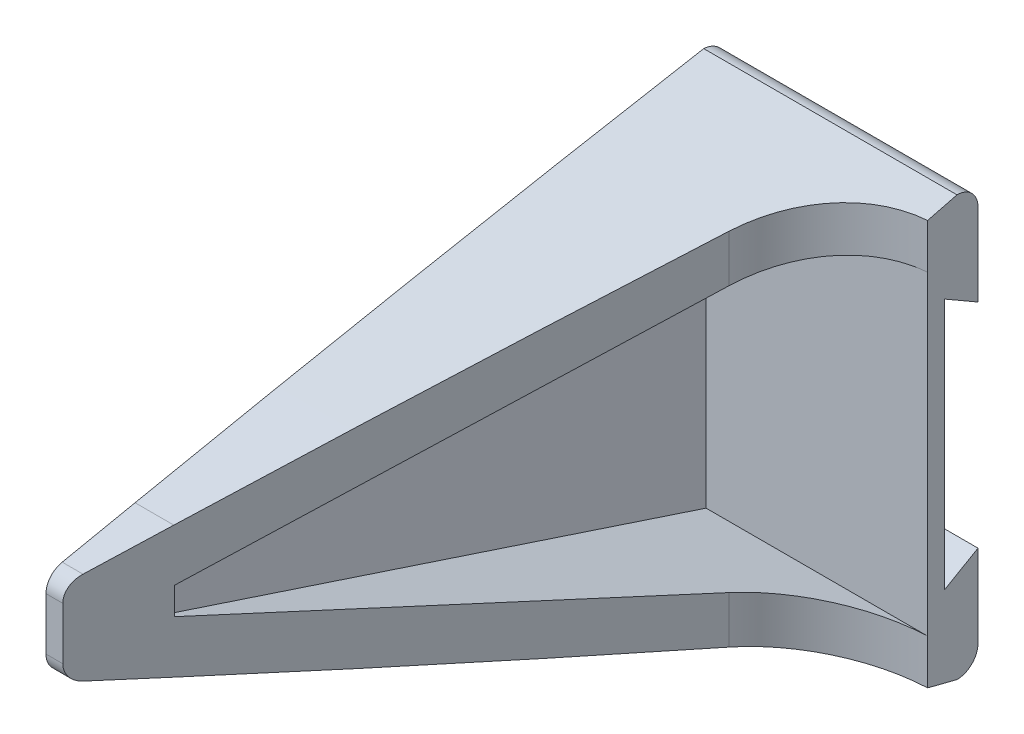
ISO-10303-21;
HEADER;
FILE_DESCRIPTION(('STEP AP214'),'2;1');
FILE_NAME('part.step','',(''),(''),'','','');
FILE_SCHEMA(('AUTOMOTIVE_DESIGN { 1 0 10303 214 1 1 1 1 }'));
ENDSEC;
DATA;
#1=APPLICATION_CONTEXT('core data for automotive mechanical design processes');
#2=APPLICATION_PROTOCOL_DEFINITION('international standard','automotive_design',2000,#1);
#3=PRODUCT_CONTEXT('',#1,'mechanical');
#4=PRODUCT('Part','Part','',(#3));
#5=PRODUCT_RELATED_PRODUCT_CATEGORY('part','',(#4));
#6=PRODUCT_DEFINITION_FORMATION('','',#4);
#7=PRODUCT_DEFINITION_CONTEXT('part definition',#1,'design');
#8=PRODUCT_DEFINITION('design','',#6,#7);
#9=PRODUCT_DEFINITION_SHAPE('','',#8);
#10=(LENGTH_UNIT() NAMED_UNIT(*) SI_UNIT(.MILLI.,.METRE.));
#11=(NAMED_UNIT(*) PLANE_ANGLE_UNIT() SI_UNIT($,.RADIAN.));
#12=(NAMED_UNIT(*) SI_UNIT($,.STERADIAN.) SOLID_ANGLE_UNIT());
#13=UNCERTAINTY_MEASURE_WITH_UNIT(LENGTH_MEASURE(1.E-05),#10,'distance_accuracy_value','');
#14=(GEOMETRIC_REPRESENTATION_CONTEXT(3) GLOBAL_UNCERTAINTY_ASSIGNED_CONTEXT((#13)) GLOBAL_UNIT_ASSIGNED_CONTEXT((#10,
#11,#12)) REPRESENTATION_CONTEXT('',''));
#15=CARTESIAN_POINT('',(0.,0.,0.));
#16=DIRECTION('',(0.,0.,1.));
#17=DIRECTION('',(1.,0.,0.));
#18=AXIS2_PLACEMENT_3D('',#15,#16,#17);
#19=CARTESIAN_POINT('',(-5.,0.,0.));
#20=DIRECTION('',(0.,0.961523946559478,-0.274721131682086));
#21=DIRECTION('',(-1.,0.,0.));
#22=AXIS2_PLACEMENT_3D('',#19,#20,#21);
#23=PLANE('',#22);
#24=DIRECTION('',(-1.,0.,0.));
#25=VECTOR('',#24,1.);
#26=CARTESIAN_POINT('',(11.2500160171539,17.1564270768965,60.0474938743614));
#27=LINE('',#26,#25);
#28=CARTESIAN_POINT('',(0.27010915556701,17.1564270768968,60.0474938743613));
#29=VERTEX_POINT('',#28);
#30=CARTESIAN_POINT('',(-4.34517418158299,17.1564270768968,60.0474938743613));
#31=VERTEX_POINT('',#30);
#32=EDGE_CURVE('E214',#29,#31,#27,.T.);
#33=ORIENTED_EDGE('',*,*,#32,.F.);
#34=DIRECTION('',(0.301252602829649,-0.26195878897275,-0.916855747742409));
#35=VECTOR('',#34,1.);
#36=CARTESIAN_POINT('',(8.15477337959658,10.3001972147053,36.0506897142713));
#37=LINE('',#36,#35);
#38=CARTESIAN_POINT('',(-2.40415206960112,19.481871655173,68.1865497770469));
#39=VERTEX_POINT('',#38);
#40=EDGE_CURVE('E255',#39,#29,#37,.T.);
#41=ORIENTED_EDGE('',*,*,#40,.F.);
#42=DIRECTION('',(0.999999994860841,-2.78517886830836E-05,-9.74812589382085E-05));
#43=VECTOR('',#42,1.);
#44=CARTESIAN_POINT('',(-4.9961902674064,19.4819438480736,68.1868024521949));
#45=LINE('',#44,#43);
#46=CARTESIAN_POINT('',(-4.8806474065743,19.4819406299982,68.1867911889313));
#47=VERTEX_POINT('',#46);
#48=EDGE_CURVE('E228',#47,#39,#45,.T.);
#49=ORIENTED_EDGE('',*,*,#48,.F.);
#50=DIRECTION('',(-0.0631311605082481,0.274173128614111,0.959605935850145));
#51=VECTOR('',#50,1.);
#52=CARTESIAN_POINT('',(-0.221379312874563,-0.752854675794736,-2.63499132601715));
#53=LINE('',#52,#51);
#54=EDGE_CURVE('E201',#31,#47,#53,.T.);
#55=ORIENTED_EDGE('',*,*,#54,.F.);
#56=EDGE_LOOP('',(#33,#41,#49,#55));
#57=FACE_BOUND('',#56,.T.);
#58=ADVANCED_FACE('F17',(#57),#23,.F.);
#59=CARTESIAN_POINT('',(30.8686455946263,50.,14.9748273723251));
#60=DIRECTION('',(0.,1.,0.));
#61=DIRECTION('',(-0.0579097063084208,0.,-0.998321824821672));
#62=AXIS2_PLACEMENT_3D('',#59,#60,#61);
#63=CYLINDRICAL_SURFACE('',#62,15.);
#64=CARTESIAN_POINT('',(16.6181693590193,46.4452021108592,10.2925280377675));
#65=CARTESIAN_POINT('',(16.7504928744578,46.55038999976,9.88967875900254));
#66=CARTESIAN_POINT('',(16.9000915577674,46.6540806618818,9.49209916432343));
#67=CARTESIAN_POINT('',(17.2328506889254,46.8577784280894,8.71021888646992));
#68=CARTESIAN_POINT('',(17.4160143939234,46.9577851735558,8.32591949631197));
#69=CARTESIAN_POINT('',(17.8150095436833,47.1534644660084,7.57319089787189));
#70=CARTESIAN_POINT('',(18.0308606807906,47.2491343548304,7.20477142939984));
#71=CARTESIAN_POINT('',(18.4938397219211,47.4353899824434,6.48680022303801));
#72=CARTESIAN_POINT('',(18.7409660845619,47.5259759714741,6.13724755651849));
#73=CARTESIAN_POINT('',(19.265279990854,47.7015080449932,5.45927399383423));
#74=CARTESIAN_POINT('',(19.5425015231269,47.7864475743285,5.13087767193375));
#75=CARTESIAN_POINT('',(20.124990929936,47.9499358524807,4.49824598358979));
#76=CARTESIAN_POINT('',(20.4302587340361,48.0284846173466,4.1940105564715));
#77=CARTESIAN_POINT('',(21.0666734538464,48.1785553382833,3.61229603263777));
#78=CARTESIAN_POINT('',(21.397809752011,48.2500801503622,3.33480606181463));
#79=CARTESIAN_POINT('',(22.0837662302931,48.3855703691712,2.80878092093615));
#80=CARTESIAN_POINT('',(22.4385852053635,48.4495361600692,2.5602442794106));
#81=CARTESIAN_POINT('',(23.161064325519,48.5680290954461,2.09955837952303));
#82=CARTESIAN_POINT('',(23.5282492459639,48.6227377382413,1.88671042008909));
#83=CARTESIAN_POINT('',(24.2802142469391,48.7240060820292,1.4925141623235));
#84=CARTESIAN_POINT('',(24.6649934127516,48.7705662060539,1.31116422876913));
#85=CARTESIAN_POINT('',(25.4491022783811,48.8551327243682,0.981640975074085));
#86=CARTESIAN_POINT('',(25.8484216545086,48.8931450551961,0.833444629763661));
#87=CARTESIAN_POINT('',(26.6587269192887,48.960329807256,0.571430078871008));
#88=CARTESIAN_POINT('',(27.0697082864151,48.9895056046793,0.45759874343676));
#89=CARTESIAN_POINT('',(27.8981270662143,49.038655875498,0.26579257016544));
#90=CARTESIAN_POINT('',(28.3155155381839,49.0586808798518,0.187620823286847));
#91=CARTESIAN_POINT('',(28.9451917950294,49.0818532564691,0.0971513952901365));
#92=CARTESIAN_POINT('',(29.1555140760904,49.0884306833989,0.0714694263869918));
#93=CARTESIAN_POINT('',(29.5771225641624,49.0992992076499,0.0290303714213888));
#94=CARTESIAN_POINT('',(29.7884088010447,49.1035902336274,0.0122735638558454));
#95=CARTESIAN_POINT('',(30.0000000000001,49.1067332100287,0.));
#96=B_SPLINE_CURVE_WITH_KNOTS('',3,(#64,#65,#66,#67,#68,#69,#70,#71,#72,#73,#74,#75,#76,#77,#78,
#79,#80,#81,#82,#83,#84,#85,#86,#87,#88,#89,#90,#91,#92,#93,#94,#95),.UNSPECIFIED.,.F.,.F.,(4,2,
2,2,2,2,2,2,2,2,2,2,2,2,2,4),(0.,1.31027882594637,2.62068486874322,3.93188352163661,
5.24301757796929,6.55564810689964,7.8682753393404,9.18036661534949,10.4923911789509,
11.7745922198976,13.0567266753576,14.3379679047848,15.6187189885599,16.892309628219,
17.5280942569491,18.1638987232685),.UNSPECIFIED.);
#97=CARTESIAN_POINT('',(16.6181693590191,46.445202110859,10.2925280377679));
#98=VERTEX_POINT('',#97);
#99=CARTESIAN_POINT('',(30.,49.1067332100289,0.));
#100=VERTEX_POINT('',#99);
#101=EDGE_CURVE('E20',#98,#100,#96,.T.);
#102=ORIENTED_EDGE('',*,*,#101,.F.);
#103=DIRECTION('',(0.,-1.,0.));
#104=VECTOR('',#103,1.);
#105=CARTESIAN_POINT('',(16.618169359019,50.,10.2925280377684));
#106=LINE('',#105,#104);
#107=CARTESIAN_POINT('',(16.618169359019,40.8191836101221,10.2925280377684));
#108=VERTEX_POINT('',#107);
#109=EDGE_CURVE('E76',#98,#108,#106,.T.);
#110=ORIENTED_EDGE('',*,*,#109,.T.);
#111=CARTESIAN_POINT('',(30.8686455946263,39.4813838384571,14.9748273723251));
#112=DIRECTION('',(0.,-0.961523949713401,-0.274721120643354));
#113=DIRECTION('',(0.,0.274721120643354,-0.961523949713401));
#114=AXIS2_PLACEMENT_3D('',#111,#112,#113);
#115=ELLIPSE('',#114,15.6002354434032,15.);
#116=CARTESIAN_POINT('',(30.,43.7599058226387,0.));
#117=VERTEX_POINT('',#116);
#118=EDGE_CURVE('E11',#108,#117,#115,.T.);
#119=ORIENTED_EDGE('',*,*,#118,.T.);
#120=DIRECTION('',(0.,-1.,0.));
#121=VECTOR('',#120,1.);
#122=CARTESIAN_POINT('',(30.,50.,0.));
#123=LINE('',#122,#121);
#124=EDGE_CURVE('E264',#100,#117,#123,.T.);
#125=ORIENTED_EDGE('',*,*,#124,.F.);
#126=EDGE_LOOP('',(#102,#110,#119,#125));
#127=FACE_BOUND('',#126,.T.);
#128=ADVANCED_FACE('F314',(#127),#63,.F.);
#129=CARTESIAN_POINT('',(-5.,43.7599058226387,0.));
#130=DIRECTION('',(0.,0.961523949713401,0.274721120643354));
#131=DIRECTION('',(1.,0.,0.));
#132=AXIS2_PLACEMENT_3D('',#129,#130,#131);
#133=PLANE('',#132);
#134=DIRECTION('',(0.0631311607145007,0.274173117593814,-0.959605938985232));
#135=VECTOR('',#134,1.);
#136=CARTESIAN_POINT('',(2.4529121272911,38.7177710550866,17.647472190454));
#137=LINE('',#136,#135);
#138=CARTESIAN_POINT('',(-0.333402682970778,26.6170491693912,60.));
#139=VERTEX_POINT('',#138);
#140=CARTESIAN_POINT('',(3.61391515759579,43.7599058226387,0.));
#141=VERTEX_POINT('',#140);
#142=EDGE_CURVE('E157',#139,#141,#137,.T.);
#143=ORIENTED_EDGE('',*,*,#142,.T.);
#144=DIRECTION('',(1.,0.,0.));
#145=VECTOR('',#144,1.);
#146=CARTESIAN_POINT('',(-5.,43.7599058226387,0.));
#147=LINE('',#146,#145);
#148=EDGE_CURVE('E46',#141,#117,#147,.T.);
#149=ORIENTED_EDGE('',*,*,#148,.T.);
#150=ORIENTED_EDGE('',*,*,#118,.F.);
#151=DIRECTION('',(0.301252603728119,0.261958778368849,-0.916855750476884));
#152=VECTOR('',#151,1.);
#153=CARTESIAN_POINT('',(6.42810010749945,31.9582540792652,41.3057822815234));
#154=LINE('',#153,#152);
#155=CARTESIAN_POINT('',(0.285714285714288,26.6170491693912,60.));
#156=VERTEX_POINT('',#155);
#157=EDGE_CURVE('E160',#156,#108,#154,.T.);
#158=ORIENTED_EDGE('',*,*,#157,.F.);
#159=DIRECTION('',(1.,0.,0.));
#160=VECTOR('',#159,1.);
#161=CARTESIAN_POINT('',(-5.,26.6170491693912,60.));
#162=LINE('',#161,#160);
#163=EDGE_CURVE('E32',#139,#156,#162,.T.);
#164=ORIENTED_EDGE('',*,*,#163,.F.);
#165=EDGE_LOOP('',(#143,#149,#150,#158,#164));
#166=FACE_BOUND('',#165,.T.);
#167=ADVANCED_FACE('F156',(#166),#133,.F.);
#168=CARTESIAN_POINT('',(-5.,26.6170491693912,60.));
#169=DIRECTION('',(0.,0.,1.));
#170=DIRECTION('',(1.,0.,0.));
#171=AXIS2_PLACEMENT_3D('',#168,#169,#170);
#172=PLANE('',#171);
#173=DIRECTION('',(0.,1.,0.));
#174=VECTOR('',#173,1.);
#175=CARTESIAN_POINT('',(-0.333402682970776,25.8085245846956,60.));
#176=LINE('',#175,#174);
#177=CARTESIAN_POINT('',(-0.333402682970778,23.3829515756669,60.));
#178=VERTEX_POINT('',#177);
#179=EDGE_CURVE('E172',#178,#139,#176,.T.);
#180=ORIENTED_EDGE('',*,*,#179,.T.);
#181=ORIENTED_EDGE('',*,*,#163,.T.);
#182=DIRECTION('',(0.,1.,0.));
#183=VECTOR('',#182,1.);
#184=CARTESIAN_POINT('',(0.285714285714287,13.3085245846956,60.));
#185=LINE('',#184,#183);
#186=CARTESIAN_POINT('',(0.285714285714288,23.3829515756669,60.));
#187=VERTEX_POINT('',#186);
#188=EDGE_CURVE('E402',#187,#156,#185,.T.);
#189=ORIENTED_EDGE('',*,*,#188,.F.);
#190=DIRECTION('',(1.,0.,0.));
#191=VECTOR('',#190,1.);
#192=CARTESIAN_POINT('',(-5.,23.3829515756669,60.));
#193=LINE('',#192,#191);
#194=EDGE_CURVE('E178',#178,#187,#193,.T.);
#195=ORIENTED_EDGE('',*,*,#194,.F.);
#196=EDGE_LOOP('',(#180,#181,#189,#195));
#197=FACE_BOUND('',#196,.T.);
#198=ADVANCED_FACE('F177',(#197),#172,.F.);
#199=CARTESIAN_POINT('',(11.2500160171539,47.5,-3.5));
#200=DIRECTION('',(1.,0.,0.));
#201=DIRECTION('',(0.,0.707106781186548,-0.707106781186548));
#202=AXIS2_PLACEMENT_3D('',#199,#200,#201);
#203=CYLINDRICAL_SURFACE('',#202,2.5);
#204=CARTESIAN_POINT('',(30.,47.5,-3.5));
#205=DIRECTION('',(-1.,0.,0.));
#206=DIRECTION('',(0.,0.707106781186548,-0.707106781186548));
#207=AXIS2_PLACEMENT_3D('',#204,#205,#206);
#208=CIRCLE('',#207,2.5);
#209=CARTESIAN_POINT('',(30.,50.,-3.5));
#210=VERTEX_POINT('',#209);
#211=CARTESIAN_POINT('',(30.,47.5,-6.));
#212=VERTEX_POINT('',#211);
#213=EDGE_CURVE('E271',#210,#212,#208,.T.);
#214=ORIENTED_EDGE('',*,*,#213,.T.);
#215=DIRECTION('',(-1.,0.,0.));
#216=VECTOR('',#215,1.);
#217=CARTESIAN_POINT('',(11.2500160171539,47.5,-6.));
#218=LINE('',#217,#216);
#219=CARTESIAN_POINT('',(0.,47.5,-6.));
#220=VERTEX_POINT('',#219);
#221=EDGE_CURVE('E166',#212,#220,#218,.T.);
#222=ORIENTED_EDGE('',*,*,#221,.T.);
#223=CARTESIAN_POINT('',(-0.164471576690273,47.5,-3.5));
#224=DIRECTION('',(0.997842927606661,0.,0.065646719837083));
#225=DIRECTION('',(0.065646719837083,0.,-0.997842927606661));
#226=AXIS2_PLACEMENT_3D('',#223,#224,#225);
#227=ELLIPSE('',#226,2.5054043385328,2.5);
#228=CARTESIAN_POINT('',(-0.164471576690274,50.,-3.5));
#229=VERTEX_POINT('',#228);
#230=EDGE_CURVE('E194',#220,#229,#227,.T.);
#231=ORIENTED_EDGE('',*,*,#230,.T.);
#232=DIRECTION('',(1.,0.,0.));
#233=VECTOR('',#232,1.);
#234=CARTESIAN_POINT('',(11.2500160171539,50.,-3.5));
#235=LINE('',#234,#233);
#236=EDGE_CURVE('E329',#229,#210,#235,.T.);
#237=ORIENTED_EDGE('',*,*,#236,.T.);
#238=EDGE_LOOP('',(#214,#222,#231,#237));
#239=FACE_BOUND('',#238,.T.);
#240=ADVANCED_FACE('F308',(#239),#203,.T.);
#241=CARTESIAN_POINT('',(15.,25.,-6.));
#242=DIRECTION('',(0.,0.,-1.));
#243=DIRECTION('',(0.,-1.,0.));
#244=AXIS2_PLACEMENT_3D('',#241,#242,#243);
#245=PLANE('',#244);
#246=DIRECTION('',(1.,0.,0.));
#247=VECTOR('',#246,1.);
#248=CARTESIAN_POINT('',(22.5,12.3094019865885,-6.));
#249=LINE('',#248,#247);
#250=CARTESIAN_POINT('',(5.,12.3094010767586,-5.99999842412783));
#251=VERTEX_POINT('',#250);
#252=CARTESIAN_POINT('',(30.,12.3094010767586,-5.99999842412783));
#253=VERTEX_POINT('',#252);
#254=EDGE_CURVE('E381',#251,#253,#249,.T.);
#255=ORIENTED_EDGE('',*,*,#254,.T.);
#256=DIRECTION('',(0.,-1.,0.));
#257=VECTOR('',#256,1.);
#258=CARTESIAN_POINT('',(30.,50.,-6.));
#259=LINE('',#258,#257);
#260=CARTESIAN_POINT('',(30.,2.5,-6.));
#261=VERTEX_POINT('',#260);
#262=EDGE_CURVE('E403',#253,#261,#259,.T.);
#263=ORIENTED_EDGE('',*,*,#262,.T.);
#264=DIRECTION('',(1.,0.,0.));
#265=VECTOR('',#264,1.);
#266=CARTESIAN_POINT('',(11.2500160171539,2.5,-6.));
#267=LINE('',#266,#265);
#268=CARTESIAN_POINT('',(0.,2.5,-6.));
#269=VERTEX_POINT('',#268);
#270=EDGE_CURVE('E220',#269,#261,#267,.T.);
#271=ORIENTED_EDGE('',*,*,#270,.F.);
#272=DIRECTION('',(0.,1.,0.));
#273=VECTOR('',#272,1.);
#274=CARTESIAN_POINT('',(0.,0.,-6.));
#275=LINE('',#274,#273);
#276=EDGE_CURVE('E200',#269,#220,#275,.T.);
#277=ORIENTED_EDGE('',*,*,#276,.T.);
#278=ORIENTED_EDGE('',*,*,#221,.F.);
#279=DIRECTION('',(0.,-1.,0.));
#280=VECTOR('',#279,1.);
#281=CARTESIAN_POINT('',(30.,50.,-6.));
#282=LINE('',#281,#280);
#283=CARTESIAN_POINT('',(30.,37.6905989232415,-6.));
#284=VERTEX_POINT('',#283);
#285=EDGE_CURVE('E382',#212,#284,#282,.T.);
#286=ORIENTED_EDGE('',*,*,#285,.T.);
#287=DIRECTION('',(-1.,0.,0.));
#288=VECTOR('',#287,1.);
#289=CARTESIAN_POINT('',(22.5,37.6905989232415,-6.));
#290=LINE('',#289,#288);
#291=CARTESIAN_POINT('',(5.,37.6905989232415,-6.));
#292=VERTEX_POINT('',#291);
#293=EDGE_CURVE('E495',#284,#292,#290,.T.);
#294=ORIENTED_EDGE('',*,*,#293,.T.);
#295=DIRECTION('',(0.,-1.,0.));
#296=VECTOR('',#295,1.);
#297=CARTESIAN_POINT('',(5.,25.,-6.));
#298=LINE('',#297,#296);
#299=EDGE_CURVE('E386',#292,#251,#298,.T.);
#300=ORIENTED_EDGE('',*,*,#299,.T.);
#301=EDGE_LOOP('',(#255,#263,#271,#277,#278,#286,#294,#300));
#302=FACE_BOUND('',#301,.T.);
#303=ADVANCED_FACE('F304',(#302),#245,.T.);
#304=CARTESIAN_POINT('',(11.2500160171539,2.5,-3.5));
#305=DIRECTION('',(-1.,0.,0.));
#306=DIRECTION('',(0.,-0.707106781186548,-0.707106781186548));
#307=AXIS2_PLACEMENT_3D('',#304,#305,#306);
#308=CYLINDRICAL_SURFACE('',#307,2.5);
#309=CARTESIAN_POINT('',(-0.164471576690273,2.5,-3.5));
#310=DIRECTION('',(0.997842927606661,0.,0.065646719837083));
#311=DIRECTION('',(0.065646719837083,0.,-0.997842927606661));
#312=AXIS2_PLACEMENT_3D('',#309,#310,#311);
#313=ELLIPSE('',#312,2.5054043385328,2.5);
#314=CARTESIAN_POINT('',(-0.164471576690274,0.,-3.5));
#315=VERTEX_POINT('',#314);
#316=EDGE_CURVE('E195',#315,#269,#313,.T.);
#317=ORIENTED_EDGE('',*,*,#316,.T.);
#318=ORIENTED_EDGE('',*,*,#270,.T.);
#319=CARTESIAN_POINT('',(30.,2.5,-3.5));
#320=DIRECTION('',(-1.,0.,0.));
#321=DIRECTION('',(0.,-0.707106781186548,-0.707106781186548));
#322=AXIS2_PLACEMENT_3D('',#319,#320,#321);
#323=CIRCLE('',#322,2.5);
#324=CARTESIAN_POINT('',(30.,0.,-3.5));
#325=VERTEX_POINT('',#324);
#326=EDGE_CURVE('E240',#261,#325,#323,.T.);
#327=ORIENTED_EDGE('',*,*,#326,.T.);
#328=DIRECTION('',(-1.,0.,0.));
#329=VECTOR('',#328,1.);
#330=CARTESIAN_POINT('',(11.2500160171539,0.,-3.5));
#331=LINE('',#330,#329);
#332=EDGE_CURVE('E279',#325,#315,#331,.T.);
#333=ORIENTED_EDGE('',*,*,#332,.T.);
#334=EDGE_LOOP('',(#317,#318,#327,#333));
#335=FACE_BOUND('',#334,.T.);
#336=ADVANCED_FACE('F296',(#335),#308,.T.);
#337=CARTESIAN_POINT('',(-5.00057692406513,28.1142469084096,67.5000000506065));
#338=DIRECTION('',(-0.999999994860841,-2.78517886830835E-05,9.74812589382086E-05));
#339=DIRECTION('',(6.1051809326197E-05,0.602195511881558,0.798348646734236));
#340=AXIS2_PLACEMENT_3D('',#337,#338,#339);
#341=CYLINDRICAL_SURFACE('',#340,2.5);
#342=CARTESIAN_POINT('',(-4.83546329912356,28.1142515071194,67.4999839551224));
#343=DIRECTION('',(0.997842927606661,0.,0.065646719837083));
#344=DIRECTION('',(-0.0656467139462456,-0.00042364003126877,0.997842838064784));
#345=AXIS2_PLACEMENT_3D('',#342,#343,#344);
#346=ELLIPSE('',#345,2.50542041906692,2.5);
#347=CARTESIAN_POINT('',(-4.88064740657429,30.5180601150599,68.1867911889313));
#348=VERTEX_POINT('',#347);
#349=CARTESIAN_POINT('',(-4.99993593138436,28.1142469194748,70.));
#350=VERTEX_POINT('',#349);
#351=EDGE_CURVE('E210',#348,#350,#346,.T.);
#352=ORIENTED_EDGE('',*,*,#351,.T.);
#353=DIRECTION('',(0.999999994860841,2.78517886830836E-05,-9.74812589382085E-05));
#354=VECTOR('',#353,1.);
#355=CARTESIAN_POINT('',(-5.00033322091769,28.1142469084096,70.0000000387283));
#356=LINE('',#355,#354);
#357=CARTESIAN_POINT('',(-2.99993594088696,28.1143026230522,69.999805037482));
#358=VERTEX_POINT('',#357);
#359=EDGE_CURVE('E224',#350,#358,#356,.T.);
#360=ORIENTED_EDGE('',*,*,#359,.T.);
#361=CARTESIAN_POINT('',(-2.1784810547197,28.1143255088278,67.4997249491469));
#362=DIRECTION('',(-0.95003174904049,0.,-0.312153288970447));
#363=DIRECTION('',(-0.31215328772865,-8.919825298282E-05,0.950031745261108));
#364=AXIS2_PLACEMENT_3D('',#361,#362,#363);
#365=ELLIPSE('',#364,2.63157530454096,2.5);
#366=CARTESIAN_POINT('',(-2.40415206960112,30.518129089885,68.1865497770469));
#367=VERTEX_POINT('',#366);
#368=EDGE_CURVE('E337',#358,#367,#365,.T.);
#369=ORIENTED_EDGE('',*,*,#368,.T.);
#370=DIRECTION('',(-0.999999994860841,-2.78517886830836E-05,9.74812589382085E-05));
#371=VECTOR('',#370,1.);
#372=CARTESIAN_POINT('',(-5.00057692406513,30.5180567748083,68.1868028798118));
#373=LINE('',#372,#371);
#374=EDGE_CURVE('E355',#367,#348,#373,.T.);
#375=ORIENTED_EDGE('',*,*,#374,.T.);
#376=EDGE_LOOP('',(#352,#360,#369,#375));
#377=FACE_BOUND('',#376,.T.);
#378=ADVANCED_FACE('F292',(#377),#341,.T.);
#379=CARTESIAN_POINT('',(-4.99993593138436,0.,70.));
#380=DIRECTION('',(9.74812589760177E-05,0.,0.999999995248702));
#381=DIRECTION('',(0.,-1.,0.));
#382=AXIS2_PLACEMENT_3D('',#379,#380,#381);
#383=PLANE('',#382);
#384=DIRECTION('',(-0.999999994860841,2.78517886830836E-05,9.74812589382085E-05));
#385=VECTOR('',#384,1.);
#386=CARTESIAN_POINT('',(-4.99594656425896,21.8857537144723,69.9999996111115));
#387=LINE('',#386,#385);
#388=CARTESIAN_POINT('',(-2.99993594088696,21.8856981220059,69.999805037482));
#389=VERTEX_POINT('',#388);
#390=CARTESIAN_POINT('',(-4.99993593138436,21.8857538255833,70.));
#391=VERTEX_POINT('',#390);
#392=EDGE_CURVE('E227',#389,#391,#387,.T.);
#393=ORIENTED_EDGE('',*,*,#392,.F.);
#394=DIRECTION('',(0.,1.,0.));
#395=VECTOR('',#394,1.);
#396=CARTESIAN_POINT('',(-2.99993594088696,0.,69.999805037482));
#397=LINE('',#396,#395);
#398=EDGE_CURVE('E344',#389,#358,#397,.T.);
#399=ORIENTED_EDGE('',*,*,#398,.T.);
#400=ORIENTED_EDGE('',*,*,#359,.F.);
#401=DIRECTION('',(0.,1.,0.));
#402=VECTOR('',#401,1.);
#403=CARTESIAN_POINT('',(-4.99993593138436,0.,70.));
#404=LINE('',#403,#402);
#405=EDGE_CURVE('E209',#391,#350,#404,.T.);
#406=ORIENTED_EDGE('',*,*,#405,.F.);
#407=EDGE_LOOP('',(#393,#399,#400,#406));
#408=FACE_BOUND('',#407,.T.);
#409=ADVANCED_FACE('F295',(#408),#383,.T.);
#410=CARTESIAN_POINT('',(-4.9961902674064,21.8857537144723,67.4999996229897));
#411=DIRECTION('',(0.999999994860841,-2.78517886830837E-05,-9.74812589382083E-05));
#412=DIRECTION('',(6.10518093261968E-05,-0.602195511881556,0.798348646734237));
#413=AXIS2_PLACEMENT_3D('',#410,#411,#412);
#414=CYLINDRICAL_SURFACE('',#413,2.5);
#415=CARTESIAN_POINT('',(-2.1784810547197,21.8856752362303,67.4997249491469));
#416=DIRECTION('',(-0.95003174904049,0.,-0.312153288970447));
#417=DIRECTION('',(-0.31215328772865,8.91982529822399E-05,0.950031745261108));
#418=AXIS2_PLACEMENT_3D('',#415,#416,#417);
#419=ELLIPSE('',#418,2.63157530454096,2.5);
#420=EDGE_CURVE('E350',#39,#389,#419,.T.);
#421=ORIENTED_EDGE('',*,*,#420,.T.);
#422=ORIENTED_EDGE('',*,*,#392,.T.);
#423=CARTESIAN_POINT('',(-4.83546329912356,21.8857492379387,67.4999839551224));
#424=DIRECTION('',(0.997842927606661,0.,0.0656467198370831));
#425=DIRECTION('',(-0.0656467139462456,0.000423640031222297,0.997842838064784));
#426=AXIS2_PLACEMENT_3D('',#423,#424,#425);
#427=ELLIPSE('',#426,2.50542041906692,2.5);
#428=EDGE_CURVE('E205',#391,#47,#427,.T.);
#429=ORIENTED_EDGE('',*,*,#428,.T.);
#430=ORIENTED_EDGE('',*,*,#48,.T.);
#431=EDGE_LOOP('',(#421,#422,#429,#430));
#432=FACE_BOUND('',#431,.T.);
#433=ADVANCED_FACE('F300',(#432),#414,.T.);
#434=CARTESIAN_POINT('',(-5.,23.3829515756669,60.));
#435=DIRECTION('',(0.,-0.961523949713401,0.274721120643354));
#436=DIRECTION('',(-1.,0.,0.));
#437=AXIS2_PLACEMENT_3D('',#434,#435,#436);
#438=PLANE('',#437);
#439=DIRECTION('',(-0.0631311607145007,0.274173117593814,0.959605938985232));
#440=VECTOR('',#439,1.);
#441=CARTESIAN_POINT('',(0.487119316844376,19.8194961885405,47.5279057888475));
#442=LINE('',#441,#440);
#443=CARTESIAN_POINT('',(3.61391515759579,6.24009492241933,0.));
#444=VERTEX_POINT('',#443);
#445=EDGE_CURVE('E181',#444,#178,#442,.T.);
#446=ORIENTED_EDGE('',*,*,#445,.T.);
#447=ORIENTED_EDGE('',*,*,#194,.T.);
#448=DIRECTION('',(-0.301252603728119,0.261958778368849,0.916855750476884));
#449=VECTOR('',#448,1.);
#450=CARTESIAN_POINT('',(-0.561582039425095,24.1197309677887,62.5787279460764));
#451=LINE('',#450,#449);
#452=CARTESIAN_POINT('',(16.618169359019,9.18081713493591,10.2925280377684));
#453=VERTEX_POINT('',#452);
#454=EDGE_CURVE('E250',#453,#187,#451,.T.);
#455=ORIENTED_EDGE('',*,*,#454,.F.);
#456=CARTESIAN_POINT('',(30.8686455946263,10.518616906601,14.9748273723251));
#457=DIRECTION('',(0.,0.961523949713401,-0.274721120643354));
#458=DIRECTION('',(0.,-0.274721120643354,-0.961523949713401));
#459=AXIS2_PLACEMENT_3D('',#456,#457,#458);
#460=ELLIPSE('',#459,15.6002354434032,15.);
#461=CARTESIAN_POINT('',(30.,6.24009492241933,0.));
#462=VERTEX_POINT('',#461);
#463=EDGE_CURVE('E182',#462,#453,#460,.T.);
#464=ORIENTED_EDGE('',*,*,#463,.F.);
#465=DIRECTION('',(1.,0.,0.));
#466=VECTOR('',#465,1.);
#467=CARTESIAN_POINT('',(-5.,6.24009492241933,0.));
#468=LINE('',#467,#466);
#469=EDGE_CURVE('E175',#444,#462,#468,.T.);
#470=ORIENTED_EDGE('',*,*,#469,.F.);
#471=EDGE_LOOP('',(#446,#447,#455,#464,#470));
#472=FACE_BOUND('',#471,.T.);
#473=ADVANCED_FACE('F656',(#472),#438,.F.);
#474=CARTESIAN_POINT('',(-5.,6.24009492241933,0.));
#475=DIRECTION('',(0.,0.,-1.));
#476=DIRECTION('',(0.,-1.,0.));
#477=AXIS2_PLACEMENT_3D('',#474,#475,#476);
#478=PLANE('',#477);
#479=DIRECTION('',(0.,-1.,0.));
#480=VECTOR('',#479,1.);
#481=CARTESIAN_POINT('',(3.61391515759579,15.6200474612097,0.));
#482=LINE('',#481,#480);
#483=EDGE_CURVE('E173',#141,#444,#482,.T.);
#484=ORIENTED_EDGE('',*,*,#483,.T.);
#485=ORIENTED_EDGE('',*,*,#469,.T.);
#486=DIRECTION('',(0.,-1.,0.));
#487=VECTOR('',#486,1.);
#488=CARTESIAN_POINT('',(30.,50.,0.));
#489=LINE('',#488,#487);
#490=EDGE_CURVE('E245',#117,#462,#489,.T.);
#491=ORIENTED_EDGE('',*,*,#490,.F.);
#492=ORIENTED_EDGE('',*,*,#148,.F.);
#493=EDGE_LOOP('',(#484,#485,#491,#492));
#494=FACE_BOUND('',#493,.T.);
#495=ADVANCED_FACE('F652',(#494),#478,.F.);
#496=CARTESIAN_POINT('',(1.49140170463865,25.,32.2626178892018));
#497=DIRECTION('',(0.997842927606661,0.,0.0656467198370825));
#498=DIRECTION('',(0.,-1.,0.));
#499=AXIS2_PLACEMENT_3D('',#496,#497,#498);
#500=PLANE('',#499);
#501=ORIENTED_EDGE('',*,*,#179,.F.);
#502=ORIENTED_EDGE('',*,*,#445,.F.);
#503=ORIENTED_EDGE('',*,*,#483,.F.);
#504=ORIENTED_EDGE('',*,*,#142,.F.);
#505=EDGE_LOOP('',(#501,#502,#503,#504));
#506=FACE_BOUND('',#505,.T.);
#507=ADVANCED_FACE('F170',(#506),#500,.T.);
#508=CARTESIAN_POINT('',(30.8686455946263,50.,14.9748273723251));
#509=DIRECTION('',(0.,1.,0.));
#510=DIRECTION('',(-0.0579097063084208,0.,-0.998321824821672));
#511=AXIS2_PLACEMENT_3D('',#508,#509,#510);
#512=CYLINDRICAL_SURFACE('',#511,15.);
#513=CARTESIAN_POINT('',(30.,0.893266830553043,0.));
#514=CARTESIAN_POINT('',(29.7936275825072,0.896332290105882,0.0119708674748377));
#515=CARTESIAN_POINT('',(29.587544653147,0.900489861202647,0.0282065164784163));
#516=CARTESIAN_POINT('',(29.1762819206712,0.910980497248957,0.0691701211227631));
#517=CARTESIAN_POINT('',(28.9711021097647,0.917313543393864,0.0938980033573248));
#518=CARTESIAN_POINT('',(28.3575406117586,0.939557746508032,0.180744383381325));
#519=CARTESIAN_POINT('',(27.9509927676084,0.958716114463411,0.255534000400799));
#520=CARTESIAN_POINT('',(27.1466142079986,1.00549798294675,0.438102666451221));
#521=CARTESIAN_POINT('',(26.748770635257,1.03310794694672,0.545828962012717));
#522=CARTESIAN_POINT('',(25.9638745560887,1.09658831858341,0.793412213233699));
#523=CARTESIAN_POINT('',(25.5768220842937,1.13245875272686,0.933269271996416));
#524=CARTESIAN_POINT('',(24.8162135784717,1.21218231196326,1.24395550065012));
#525=CARTESIAN_POINT('',(24.4426575885048,1.25603546311342,1.4147847716407));
#526=CARTESIAN_POINT('',(23.7115590718047,1.35139324989032,1.7860366088902));
#527=CARTESIAN_POINT('',(23.35401716138,1.40289817967019,1.98646031282988));
#528=CARTESIAN_POINT('',(22.6572988324478,1.51317955002621,2.41532359756943));
#529=CARTESIAN_POINT('',(22.3181238514839,1.57195655859459,2.64376536673324));
#530=CARTESIAN_POINT('',(21.6603496186867,1.6963506766349,3.1268820943176));
#531=CARTESIAN_POINT('',(21.3417502240764,1.76196773863446,3.38155687067171));
#532=CARTESIAN_POINT('',(20.7223689479569,1.90063746337816,3.91933760203224));
#533=CARTESIAN_POINT('',(20.4219367763367,1.97378902581638,4.20282082052123));
#534=CARTESIAN_POINT('',(19.8461850806875,2.12614349489603,4.79272291496167));
#535=CARTESIAN_POINT('',(19.5708658194693,2.20534646485051,5.09914203087998));
#536=CARTESIAN_POINT('',(19.0469980864087,2.36925156043632,5.73266549975236));
#537=CARTESIAN_POINT('',(18.7984478408321,2.45395332111699,6.05976847989637));
#538=CARTESIAN_POINT('',(18.3296071357792,2.62825239299809,6.73222054362206));
#539=CARTESIAN_POINT('',(18.1093102621784,2.71784858644728,7.07756546066631));
#540=CARTESIAN_POINT('',(17.6392491703175,2.92766091642181,7.88544930335965));
#541=CARTESIAN_POINT('',(17.3990709124621,3.04930698178632,8.35326269395249));
#542=CARTESIAN_POINT('',(17.0772052512868,3.23598844355636,9.07018910574989));
#543=CARTESIAN_POINT('',(16.9763898047112,3.29885973784203,9.31147710349339));
#544=CARTESIAN_POINT('',(16.7876083566267,3.42589390775522,9.79867224731202));
#545=CARTESIAN_POINT('',(16.6996413330231,3.49005668018285,10.044579024204));
#546=CARTESIAN_POINT('',(16.6181693590189,3.5547980493689,10.2925280377685));
#547=B_SPLINE_CURVE_WITH_KNOTS('',3,(#513,#514,#515,#516,#517,#518,#519,#520,#521,#522,#523,
#524,#525,#526,#527,#528,#529,#530,#531,#532,#533,#534,#535,#536,#537,#538,#539,#540,#541,#542,
#543,#544,#545,#546),.UNSPECIFIED.,.F.,.F.,(4,2,2,2,2,2,2,2,2,2,2,2,2,2,2,2,4),(0.,
0.620127652015381,1.24024994383026,2.48006289427067,3.71790039304664,4.95574186392959,
6.19358737545157,7.43148048510949,8.66947034262662,9.9074516086304,11.1644870835785,
12.4215357121008,13.678500996363,14.9351804153711,16.5511948732169,17.3577652757939,
18.1642714805395),.UNSPECIFIED.);
#548=CARTESIAN_POINT('',(30.,0.893266830552691,0.));
#549=VERTEX_POINT('',#548);
#550=CARTESIAN_POINT('',(16.6181693590189,3.55479804936865,10.2925280377685));
#551=VERTEX_POINT('',#550);
#552=EDGE_CURVE('E190',#549,#551,#547,.T.);
#553=ORIENTED_EDGE('',*,*,#552,.F.);
#554=DIRECTION('',(0.,-1.,0.));
#555=VECTOR('',#554,1.);
#556=CARTESIAN_POINT('',(30.,50.,0.));
#557=LINE('',#556,#555);
#558=EDGE_CURVE('E241',#462,#549,#557,.T.);
#559=ORIENTED_EDGE('',*,*,#558,.F.);
#560=ORIENTED_EDGE('',*,*,#463,.T.);
#561=DIRECTION('',(0.,-1.,0.));
#562=VECTOR('',#561,1.);
#563=CARTESIAN_POINT('',(16.618169359019,50.,10.2925280377684));
#564=LINE('',#563,#562);
#565=EDGE_CURVE('E246',#453,#551,#564,.T.);
#566=ORIENTED_EDGE('',*,*,#565,.T.);
#567=EDGE_LOOP('',(#553,#559,#560,#566));
#568=FACE_BOUND('',#567,.T.);
#569=ADVANCED_FACE('F280',(#568),#512,.F.);
#570=CARTESIAN_POINT('',(11.2500160171539,2183.4698786754,-558.899215805379));
#571=DIRECTION('',(-1.,0.,0.));
#572=DIRECTION('',(0.,-0.969138872026365,0.246515408701899));
#573=AXIS2_PLACEMENT_3D('',#570,#571,#572);
#574=CYLINDRICAL_SURFACE('',#573,2253.);
#575=CARTESIAN_POINT('',(203.638313764624,2183.4698786754,-558.899215805379));
#576=DIRECTION('',(-0.95003174904049,0.,-0.312153288970447));
#577=DIRECTION('',(-0.312153288970447,0.,0.95003174904049));
#578=AXIS2_PLACEMENT_3D('',#575,#576,#577);
#579=ELLIPSE('',#578,2371.49969174765,2253.);
#580=EDGE_CURVE('E251',#551,#29,#579,.T.);
#581=ORIENTED_EDGE('',*,*,#580,.T.);
#582=ORIENTED_EDGE('',*,*,#32,.T.);
#583=CARTESIAN_POINT('',(36.3744823097309,2183.4698786754,-558.899215805379));
#584=DIRECTION('',(0.997842927606661,0.,0.065646719837083));
#585=DIRECTION('',(-0.065646719837083,0.,0.997842927606661));
#586=AXIS2_PLACEMENT_3D('',#583,#584,#585);
#587=ELLIPSE('',#586,2257.87038988576,2253.);
#588=EDGE_CURVE('E199',#31,#315,#587,.T.);
#589=ORIENTED_EDGE('',*,*,#588,.T.);
#590=ORIENTED_EDGE('',*,*,#332,.F.);
#591=CARTESIAN_POINT('',(30.,2183.4698786754,-558.899215805379));
#592=DIRECTION('',(-1.,0.,0.));
#593=DIRECTION('',(0.,-0.969138872026365,0.246515408701899));
#594=AXIS2_PLACEMENT_3D('',#591,#592,#593);
#595=CIRCLE('',#594,2253.);
#596=EDGE_CURVE('E236',#325,#549,#595,.T.);
#597=ORIENTED_EDGE('',*,*,#596,.T.);
#598=ORIENTED_EDGE('',*,*,#552,.T.);
#599=EDGE_LOOP('',(#581,#582,#589,#590,#597,#598));
#600=FACE_BOUND('',#599,.T.);
#601=ADVANCED_FACE('F284',(#600),#574,.T.);
#602=CARTESIAN_POINT('',(0.,0.,-6.));
#603=DIRECTION('',(-0.997842927606661,0.,-0.065646719837083));
#604=DIRECTION('',(-0.065646719837083,0.,0.997842927606661));
#605=AXIS2_PLACEMENT_3D('',#602,#603,#604);
#606=PLANE('',#605);
#607=CARTESIAN_POINT('',(36.3744807461551,-2133.46988472082,-558.899192038723));
#608=DIRECTION('',(0.997842927606661,0.,0.065646719837083));
#609=DIRECTION('',(-0.065646719837083,0.,0.997842927606661));
#610=AXIS2_PLACEMENT_3D('',#607,#608,#609);
#611=ELLIPSE('',#610,2257.87038988576,2253.);
#612=CARTESIAN_POINT('',(-4.34517574515877,32.843566877688,60.0475176410176));
#613=VERTEX_POINT('',#612);
#614=EDGE_CURVE('E407',#229,#613,#611,.T.);
#615=ORIENTED_EDGE('',*,*,#614,.F.);
#616=ORIENTED_EDGE('',*,*,#230,.F.);
#617=ORIENTED_EDGE('',*,*,#276,.F.);
#618=ORIENTED_EDGE('',*,*,#316,.F.);
#619=ORIENTED_EDGE('',*,*,#588,.F.);
#620=ORIENTED_EDGE('',*,*,#54,.T.);
#621=ORIENTED_EDGE('',*,*,#428,.F.);
#622=ORIENTED_EDGE('',*,*,#405,.T.);
#623=ORIENTED_EDGE('',*,*,#351,.F.);
#624=DIRECTION('',(0.0631311605082481,0.274173128614111,-0.959605935850145));
#625=VECTOR('',#624,1.);
#626=CARTESIAN_POINT('',(-2.94752596716616,38.9134380673517,38.8029687937631));
#627=LINE('',#626,#625);
#628=EDGE_CURVE('E258',#348,#613,#627,.T.);
#629=ORIENTED_EDGE('',*,*,#628,.T.);
#630=EDGE_LOOP('',(#615,#616,#617,#618,#619,#620,#621,#622,#623,#629));
#631=FACE_BOUND('',#630,.T.);
#632=ADVANCED_FACE('F289',(#631),#606,.T.);
#633=CARTESIAN_POINT('',(-5.,30.0000004470348,70.));
#634=DIRECTION('',(0.,-0.961523946559478,-0.274721131682086));
#635=DIRECTION('',(0.,0.274721131682086,-0.961523946559478));
#636=AXIS2_PLACEMENT_3D('',#633,#634,#635);
#637=PLANE('',#636);
#638=DIRECTION('',(1.,0.,0.));
#639=VECTOR('',#638,1.);
#640=CARTESIAN_POINT('',(11.2500160171539,32.8435668776882,60.0475176410177));
#641=LINE('',#640,#639);
#642=CARTESIAN_POINT('',(0.270101346522783,32.843566877688,60.0475176410176));
#643=VERTEX_POINT('',#642);
#644=EDGE_CURVE('E263',#613,#643,#641,.T.);
#645=ORIENTED_EDGE('',*,*,#644,.F.);
#646=ORIENTED_EDGE('',*,*,#628,.F.);
#647=ORIENTED_EDGE('',*,*,#374,.F.);
#648=DIRECTION('',(-0.301252602829649,-0.26195878897275,0.916855747742409));
#649=VECTOR('',#648,1.);
#650=CARTESIAN_POINT('',(-4.27445982192158,28.8917744984153,73.87879076237));
#651=LINE('',#650,#649);
#652=EDGE_CURVE('E89',#643,#367,#651,.T.);
#653=ORIENTED_EDGE('',*,*,#652,.F.);
#654=EDGE_LOOP('',(#645,#646,#647,#653));
#655=FACE_BOUND('',#654,.T.);
#656=ADVANCED_FACE('F755',(#655),#637,.F.);
#657=CARTESIAN_POINT('',(-2.99993594088696,0.,69.999805037482));
#658=DIRECTION('',(0.95003174904049,0.,0.312153288970447));
#659=DIRECTION('',(0.,-1.,0.));
#660=AXIS2_PLACEMENT_3D('',#657,#658,#659);
#661=PLANE('',#660);
#662=CARTESIAN_POINT('',(203.63830595558,-2133.46988472082,-558.899192038723));
#663=DIRECTION('',(-0.95003174904049,0.,-0.312153288970447));
#664=DIRECTION('',(-0.312153288970447,0.,0.95003174904049));
#665=AXIS2_PLACEMENT_3D('',#662,#663,#664);
#666=ELLIPSE('',#665,2371.49969174765,2253.);
#667=EDGE_CURVE('E259',#643,#98,#666,.T.);
#668=ORIENTED_EDGE('',*,*,#667,.F.);
#669=ORIENTED_EDGE('',*,*,#652,.T.);
#670=ORIENTED_EDGE('',*,*,#368,.F.);
#671=ORIENTED_EDGE('',*,*,#398,.F.);
#672=ORIENTED_EDGE('',*,*,#420,.F.);
#673=ORIENTED_EDGE('',*,*,#40,.T.);
#674=ORIENTED_EDGE('',*,*,#580,.F.);
#675=ORIENTED_EDGE('',*,*,#565,.F.);
#676=ORIENTED_EDGE('',*,*,#454,.T.);
#677=ORIENTED_EDGE('',*,*,#188,.T.);
#678=ORIENTED_EDGE('',*,*,#157,.T.);
#679=ORIENTED_EDGE('',*,*,#109,.F.);
#680=EDGE_LOOP('',(#668,#669,#670,#671,#672,#673,#674,#675,#676,#677,#678,#679));
#681=FACE_BOUND('',#680,.T.);
#682=ADVANCED_FACE('F333',(#681),#661,.T.);
#683=CARTESIAN_POINT('',(11.2500160171539,-2133.46988472082,-558.899192038723));
#684=DIRECTION('',(1.,0.,0.));
#685=DIRECTION('',(0.,0.969138874709639,0.246515398153006));
#686=AXIS2_PLACEMENT_3D('',#683,#684,#685);
#687=CYLINDRICAL_SURFACE('',#686,2253.);
#688=ORIENTED_EDGE('',*,*,#614,.T.);
#689=ORIENTED_EDGE('',*,*,#644,.T.);
#690=ORIENTED_EDGE('',*,*,#667,.T.);
#691=ORIENTED_EDGE('',*,*,#101,.T.);
#692=CARTESIAN_POINT('',(30.,-2133.46988472082,-558.899192038723));
#693=DIRECTION('',(-1.,0.,0.));
#694=DIRECTION('',(0.,0.969138874709639,0.246515398153006));
#695=AXIS2_PLACEMENT_3D('',#692,#693,#694);
#696=CIRCLE('',#695,2253.);
#697=EDGE_CURVE('E268',#100,#210,#696,.T.);
#698=ORIENTED_EDGE('',*,*,#697,.T.);
#699=ORIENTED_EDGE('',*,*,#236,.F.);
#700=EDGE_LOOP('',(#688,#689,#690,#691,#698,#699));
#701=FACE_BOUND('',#700,.T.);
#702=ADVANCED_FACE('F332',(#701),#687,.T.);
#703=CARTESIAN_POINT('',(30.,50.,0.));
#704=DIRECTION('',(1.,0.,0.));
#705=DIRECTION('',(0.,1.,0.));
#706=AXIS2_PLACEMENT_3D('',#703,#704,#705);
#707=PLANE('',#706);
#708=DIRECTION('',(0.,-0.499999892460126,0.866025465872605));
#709=VECTOR('',#708,1.);
#710=CARTESIAN_POINT('',(30.,15.721686337317,-11.9102515602343));
#711=LINE('',#710,#709);
#712=CARTESIAN_POINT('',(30.,10.0000004967055,-1.99999813735488));
#713=VERTEX_POINT('',#712);
#714=EDGE_CURVE('E376',#253,#713,#711,.T.);
#715=ORIENTED_EDGE('',*,*,#714,.T.);
#716=DIRECTION('',(0.,1.,0.));
#717=VECTOR('',#716,1.);
#718=CARTESIAN_POINT('',(30.,30.0000002483527,-2.));
#719=LINE('',#718,#717);
#720=CARTESIAN_POINT('',(30.,40.,-2.));
#721=VERTEX_POINT('',#720);
#722=EDGE_CURVE('E370',#713,#721,#719,.T.);
#723=ORIENTED_EDGE('',*,*,#722,.T.);
#724=DIRECTION('',(0.,-0.5,-0.86602540378444));
#725=VECTOR('',#724,1.);
#726=CARTESIAN_POINT('',(30.,41.6830127018922,0.915063509461093));
#727=LINE('',#726,#725);
#728=EDGE_CURVE('E515',#721,#284,#727,.T.);
#729=ORIENTED_EDGE('',*,*,#728,.T.);
#730=ORIENTED_EDGE('',*,*,#285,.F.);
#731=ORIENTED_EDGE('',*,*,#213,.F.);
#732=ORIENTED_EDGE('',*,*,#697,.F.);
#733=ORIENTED_EDGE('',*,*,#124,.T.);
#734=ORIENTED_EDGE('',*,*,#490,.T.);
#735=ORIENTED_EDGE('',*,*,#558,.T.);
#736=ORIENTED_EDGE('',*,*,#596,.F.);
#737=ORIENTED_EDGE('',*,*,#326,.F.);
#738=ORIENTED_EDGE('',*,*,#262,.F.);
#739=EDGE_LOOP('',(#715,#723,#729,#730,#731,#732,#733,#734,#735,#736,#737,#738));
#740=FACE_BOUND('',#739,.T.);
#741=ADVANCED_FACE('F660',(#740),#707,.T.);
#742=CARTESIAN_POINT('',(5.,25.,-3.99999906867744));
#743=DIRECTION('',(-1.,0.,0.));
#744=DIRECTION('',(0.,0.,1.));
#745=AXIS2_PLACEMENT_3D('',#742,#743,#744);
#746=PLANE('',#745);
#747=ORIENTED_EDGE('',*,*,#299,.F.);
#748=DIRECTION('',(0.,-0.5,-0.86602540378444));
#749=VECTOR('',#748,1.);
#750=CARTESIAN_POINT('',(5.,37.6905989232415,-6.));
#751=LINE('',#750,#749);
#752=CARTESIAN_POINT('',(5.,40.,-2.));
#753=VERTEX_POINT('',#752);
#754=EDGE_CURVE('E501',#753,#292,#751,.T.);
#755=ORIENTED_EDGE('',*,*,#754,.F.);
#756=DIRECTION('',(0.,1.,0.));
#757=VECTOR('',#756,1.);
#758=CARTESIAN_POINT('',(5.,40.,-2.));
#759=LINE('',#758,#757);
#760=CARTESIAN_POINT('',(5.,10.0000004967055,-1.99999813735488));
#761=VERTEX_POINT('',#760);
#762=EDGE_CURVE('E372',#761,#753,#759,.T.);
#763=ORIENTED_EDGE('',*,*,#762,.F.);
#764=DIRECTION('',(0.,-0.499999892460126,0.866025465872605));
#765=VECTOR('',#764,1.);
#766=CARTESIAN_POINT('',(5.,12.3094010767586,-5.99999842412783));
#767=LINE('',#766,#765);
#768=EDGE_CURVE('E390',#251,#761,#767,.T.);
#769=ORIENTED_EDGE('',*,*,#768,.F.);
#770=EDGE_LOOP('',(#747,#755,#763,#769));
#771=FACE_BOUND('',#770,.T.);
#772=ADVANCED_FACE('F677',(#771),#746,.F.);
#773=CARTESIAN_POINT('',(30.,12.3094010767586,-5.99999842412783));
#774=DIRECTION('',(0.,-0.866025465872605,-0.499999892460126));
#775=DIRECTION('',(0.,0.499999892460126,-0.866025465872605));
#776=AXIS2_PLACEMENT_3D('',#773,#774,#775);
#777=PLANE('',#776);
#778=ORIENTED_EDGE('',*,*,#714,.F.);
#779=ORIENTED_EDGE('',*,*,#254,.F.);
#780=ORIENTED_EDGE('',*,*,#768,.T.);
#781=DIRECTION('',(-1.,0.,0.));
#782=VECTOR('',#781,1.);
#783=CARTESIAN_POINT('',(30.,10.0000004967055,-1.99999813735488));
#784=LINE('',#783,#782);
#785=EDGE_CURVE('E377',#713,#761,#784,.T.);
#786=ORIENTED_EDGE('',*,*,#785,.F.);
#787=EDGE_LOOP('',(#778,#779,#780,#786));
#788=FACE_BOUND('',#787,.T.);
#789=ADVANCED_FACE('F687',(#788),#777,.F.);
#790=CARTESIAN_POINT('',(30.,10.0000004967055,-2.));
#791=DIRECTION('',(0.,0.,1.));
#792=DIRECTION('',(0.,-1.,0.));
#793=AXIS2_PLACEMENT_3D('',#790,#791,#792);
#794=PLANE('',#793);
#795=ORIENTED_EDGE('',*,*,#722,.F.);
#796=ORIENTED_EDGE('',*,*,#785,.T.);
#797=ORIENTED_EDGE('',*,*,#762,.T.);
#798=DIRECTION('',(-1.,0.,0.));
#799=VECTOR('',#798,1.);
#800=CARTESIAN_POINT('',(30.,40.,-2.));
#801=LINE('',#800,#799);
#802=EDGE_CURVE('E508',#721,#753,#801,.T.);
#803=ORIENTED_EDGE('',*,*,#802,.F.);
#804=EDGE_LOOP('',(#795,#796,#797,#803));
#805=FACE_BOUND('',#804,.T.);
#806=ADVANCED_FACE('F683',(#805),#794,.F.);
#807=CARTESIAN_POINT('',(30.,40.,-2.));
#808=DIRECTION('',(0.,0.86602540378444,-0.5));
#809=DIRECTION('',(-1.,0.,0.));
#810=AXIS2_PLACEMENT_3D('',#807,#808,#809);
#811=PLANE('',#810);
#812=ORIENTED_EDGE('',*,*,#728,.F.);
#813=ORIENTED_EDGE('',*,*,#802,.T.);
#814=ORIENTED_EDGE('',*,*,#754,.T.);
#815=ORIENTED_EDGE('',*,*,#293,.F.);
#816=EDGE_LOOP('',(#812,#813,#814,#815));
#817=FACE_BOUND('',#816,.T.);
#818=ADVANCED_FACE('F672',(#817),#811,.F.);
#819=CLOSED_SHELL('',(#58,#128,#167,#198,#240,#303,#336,#378,#409,#433,#473,#495,#507,#569,#601,
#632,#656,#682,#702,#741,#772,#789,#806,#818));
#820=MANIFOLD_SOLID_BREP('B1',#819);
#821=ADVANCED_BREP_SHAPE_REPRESENTATION('',(#18,#820),#14);
#822=SHAPE_DEFINITION_REPRESENTATION(#9,#821);
ENDSEC;
END-ISO-10303-21;
